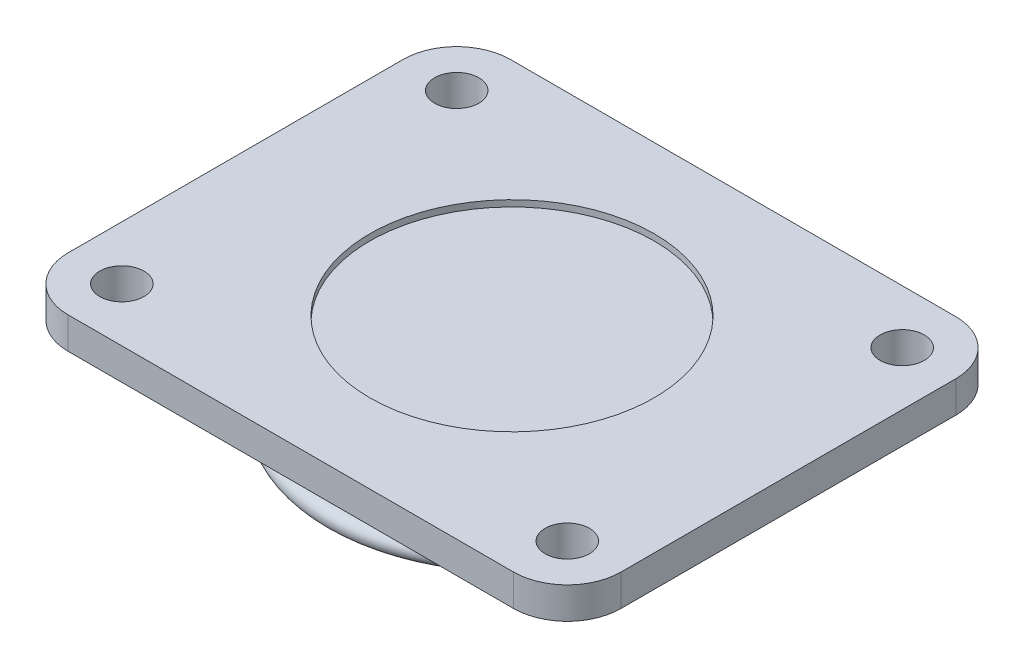
ISO-10303-21;
HEADER;
FILE_DESCRIPTION(('STEP AP214'),'2;1');
FILE_NAME('part.step','',(''),(''),'','','');
FILE_SCHEMA(('AUTOMOTIVE_DESIGN { 1 0 10303 214 1 1 1 1 }'));
ENDSEC;
DATA;
#1=APPLICATION_CONTEXT('core data for automotive mechanical design processes');
#2=APPLICATION_PROTOCOL_DEFINITION('international standard','automotive_design',2000,#1);
#3=PRODUCT_CONTEXT('',#1,'mechanical');
#4=PRODUCT('Part','Part','',(#3));
#5=PRODUCT_RELATED_PRODUCT_CATEGORY('part','',(#4));
#6=PRODUCT_DEFINITION_FORMATION('','',#4);
#7=PRODUCT_DEFINITION_CONTEXT('part definition',#1,'design');
#8=PRODUCT_DEFINITION('design','',#6,#7);
#9=PRODUCT_DEFINITION_SHAPE('','',#8);
#10=(LENGTH_UNIT() NAMED_UNIT(*) SI_UNIT(.MILLI.,.METRE.));
#11=(NAMED_UNIT(*) PLANE_ANGLE_UNIT() SI_UNIT($,.RADIAN.));
#12=(NAMED_UNIT(*) SI_UNIT($,.STERADIAN.) SOLID_ANGLE_UNIT());
#13=UNCERTAINTY_MEASURE_WITH_UNIT(LENGTH_MEASURE(1.E-05),#10,'distance_accuracy_value','');
#14=(GEOMETRIC_REPRESENTATION_CONTEXT(3) GLOBAL_UNCERTAINTY_ASSIGNED_CONTEXT((#13)) GLOBAL_UNIT_ASSIGNED_CONTEXT((#10,
#11,#12)) REPRESENTATION_CONTEXT('',''));
#15=CARTESIAN_POINT('',(0.,0.,0.));
#16=DIRECTION('',(0.,0.,1.));
#17=DIRECTION('',(1.,0.,0.));
#18=AXIS2_PLACEMENT_3D('',#15,#16,#17);
#19=CARTESIAN_POINT('',(-70.5,10.,53.));
#20=DIRECTION('',(0.,-1.,0.));
#21=DIRECTION('',(0.,0.,-1.));
#22=AXIS2_PLACEMENT_3D('',#19,#20,#21);
#23=PLANE('',#22);
#24=CARTESIAN_POINT('',(0.,10.,0.));
#25=DIRECTION('',(0.,1.,0.));
#26=DIRECTION('',(0.,0.,1.));
#27=AXIS2_PLACEMENT_3D('',#24,#25,#26);
#28=CIRCLE('',#27,45.);
#29=CARTESIAN_POINT('',(0.,10.,45.));
#30=VERTEX_POINT('',#29);
#31=EDGE_CURVE('E288',#30,#30,#28,.T.);
#32=ORIENTED_EDGE('',*,*,#31,.F.);
#33=EDGE_LOOP('',(#32));
#34=FACE_BOUND('',#33,.T.);
#35=CARTESIAN_POINT('',(-70.5,10.,53.));
#36=DIRECTION('',(0.,1.,0.));
#37=DIRECTION('',(0.,0.,-1.));
#38=AXIS2_PLACEMENT_3D('',#35,#36,#37);
#39=CIRCLE('',#38,17.);
#40=CARTESIAN_POINT('',(-87.5,10.,52.9999999999999));
#41=VERTEX_POINT('',#40);
#42=CARTESIAN_POINT('',(-70.4999999999999,10.,70.));
#43=VERTEX_POINT('',#42);
#44=EDGE_CURVE('E150',#41,#43,#39,.T.);
#45=ORIENTED_EDGE('',*,*,#44,.T.);
#46=DIRECTION('',(1.,0.,0.));
#47=VECTOR('',#46,1.);
#48=CARTESIAN_POINT('',(70.4999999999999,10.,70.));
#49=LINE('',#48,#47);
#50=CARTESIAN_POINT('',(70.4999999999999,10.,70.));
#51=VERTEX_POINT('',#50);
#52=EDGE_CURVE('E98',#43,#51,#49,.T.);
#53=ORIENTED_EDGE('',*,*,#52,.T.);
#54=CARTESIAN_POINT('',(70.5,10.,53.));
#55=DIRECTION('',(0.,1.,0.));
#56=DIRECTION('',(0.,0.,1.));
#57=AXIS2_PLACEMENT_3D('',#54,#55,#56);
#58=CIRCLE('',#57,17.);
#59=CARTESIAN_POINT('',(87.5,10.,52.9999999999999));
#60=VERTEX_POINT('',#59);
#61=EDGE_CURVE('E201',#51,#60,#58,.T.);
#62=ORIENTED_EDGE('',*,*,#61,.T.);
#63=DIRECTION('',(0.,0.,-1.));
#64=VECTOR('',#63,1.);
#65=CARTESIAN_POINT('',(87.5,10.,52.9999999999999));
#66=LINE('',#65,#64);
#67=CARTESIAN_POINT('',(87.5,10.,-52.9999999999999));
#68=VERTEX_POINT('',#67);
#69=EDGE_CURVE('E203',#60,#68,#66,.T.);
#70=ORIENTED_EDGE('',*,*,#69,.T.);
#71=CARTESIAN_POINT('',(70.5,10.,-53.));
#72=DIRECTION('',(0.,1.,0.));
#73=DIRECTION('',(0.,0.,1.));
#74=AXIS2_PLACEMENT_3D('',#71,#72,#73);
#75=CIRCLE('',#74,17.);
#76=CARTESIAN_POINT('',(70.4999999999999,10.,-70.));
#77=VERTEX_POINT('',#76);
#78=EDGE_CURVE('E117',#68,#77,#75,.T.);
#79=ORIENTED_EDGE('',*,*,#78,.T.);
#80=DIRECTION('',(-1.,0.,0.));
#81=VECTOR('',#80,1.);
#82=CARTESIAN_POINT('',(70.4999999999999,10.,-70.));
#83=LINE('',#82,#81);
#84=CARTESIAN_POINT('',(-70.4999999999999,10.,-70.));
#85=VERTEX_POINT('',#84);
#86=EDGE_CURVE('E111',#77,#85,#83,.T.);
#87=ORIENTED_EDGE('',*,*,#86,.T.);
#88=CARTESIAN_POINT('',(-70.5,10.,-53.));
#89=DIRECTION('',(0.,1.,0.));
#90=DIRECTION('',(0.,0.,1.));
#91=AXIS2_PLACEMENT_3D('',#88,#89,#90);
#92=CIRCLE('',#91,17.);
#93=CARTESIAN_POINT('',(-87.5,10.,-52.9999999999999));
#94=VERTEX_POINT('',#93);
#95=EDGE_CURVE('E115',#85,#94,#92,.T.);
#96=ORIENTED_EDGE('',*,*,#95,.T.);
#97=DIRECTION('',(0.,0.,1.));
#98=VECTOR('',#97,1.);
#99=CARTESIAN_POINT('',(-87.5,10.,52.9999999999999));
#100=LINE('',#99,#98);
#101=EDGE_CURVE('E54',#94,#41,#100,.T.);
#102=ORIENTED_EDGE('',*,*,#101,.T.);
#103=EDGE_LOOP('',(#45,#53,#62,#70,#79,#87,#96,#102));
#104=FACE_BOUND('',#103,.T.);
#105=CARTESIAN_POINT('',(-70.5,10.,-53.));
#106=DIRECTION('',(0.,1.,0.));
#107=DIRECTION('',(0.,0.,1.));
#108=AXIS2_PLACEMENT_3D('',#105,#106,#107);
#109=CIRCLE('',#108,7.);
#110=CARTESIAN_POINT('',(-70.5,10.,-46.));
#111=VERTEX_POINT('',#110);
#112=EDGE_CURVE('E139',#111,#111,#109,.T.);
#113=ORIENTED_EDGE('',*,*,#112,.F.);
#114=EDGE_LOOP('',(#113));
#115=FACE_BOUND('',#114,.T.);
#116=CARTESIAN_POINT('',(70.5,10.,-53.));
#117=DIRECTION('',(0.,1.,0.));
#118=DIRECTION('',(0.,0.,1.));
#119=AXIS2_PLACEMENT_3D('',#116,#117,#118);
#120=CIRCLE('',#119,7.);
#121=CARTESIAN_POINT('',(70.5,10.,-46.));
#122=VERTEX_POINT('',#121);
#123=EDGE_CURVE('E189',#122,#122,#120,.T.);
#124=ORIENTED_EDGE('',*,*,#123,.F.);
#125=EDGE_LOOP('',(#124));
#126=FACE_BOUND('',#125,.T.);
#127=CARTESIAN_POINT('',(70.5,10.,53.));
#128=DIRECTION('',(0.,1.,0.));
#129=DIRECTION('',(0.,0.,1.));
#130=AXIS2_PLACEMENT_3D('',#127,#128,#129);
#131=CIRCLE('',#130,7.);
#132=CARTESIAN_POINT('',(70.5,10.,60.));
#133=VERTEX_POINT('',#132);
#134=EDGE_CURVE('E183',#133,#133,#131,.T.);
#135=ORIENTED_EDGE('',*,*,#134,.F.);
#136=EDGE_LOOP('',(#135));
#137=FACE_BOUND('',#136,.T.);
#138=CARTESIAN_POINT('',(-70.5,10.,53.));
#139=DIRECTION('',(0.,1.,0.));
#140=DIRECTION('',(0.,0.,1.));
#141=AXIS2_PLACEMENT_3D('',#138,#139,#140);
#142=CIRCLE('',#141,7.);
#143=CARTESIAN_POINT('',(-70.5,10.,60.));
#144=VERTEX_POINT('',#143);
#145=EDGE_CURVE('E176',#144,#144,#142,.T.);
#146=ORIENTED_EDGE('',*,*,#145,.F.);
#147=EDGE_LOOP('',(#146));
#148=FACE_BOUND('',#147,.T.);
#149=ADVANCED_FACE('F37',(#34,#104,#115,#126,#137,#148),#23,.F.);
#150=CARTESIAN_POINT('',(-70.5,0.,53.));
#151=DIRECTION('',(0.,-1.,0.));
#152=DIRECTION('',(0.,0.,-1.));
#153=AXIS2_PLACEMENT_3D('',#150,#151,#152);
#154=PLANE('',#153);
#155=CARTESIAN_POINT('',(0.,0.,0.));
#156=DIRECTION('',(0.,-1.,0.));
#157=DIRECTION('',(0.,0.,-1.));
#158=AXIS2_PLACEMENT_3D('',#155,#156,#157);
#159=CIRCLE('',#158,56.);
#160=CARTESIAN_POINT('',(0.,0.,-56.));
#161=VERTEX_POINT('',#160);
#162=EDGE_CURVE('E164',#161,#161,#159,.T.);
#163=ORIENTED_EDGE('',*,*,#162,.F.);
#164=EDGE_LOOP('',(#163));
#165=FACE_BOUND('',#164,.T.);
#166=CARTESIAN_POINT('',(70.5,0.,53.));
#167=DIRECTION('',(0.,1.,0.));
#168=DIRECTION('',(0.,0.,1.));
#169=AXIS2_PLACEMENT_3D('',#166,#167,#168);
#170=CIRCLE('',#169,7.);
#171=CARTESIAN_POINT('',(70.5,0.,60.));
#172=VERTEX_POINT('',#171);
#173=EDGE_CURVE('E179',#172,#172,#170,.T.);
#174=ORIENTED_EDGE('',*,*,#173,.T.);
#175=EDGE_LOOP('',(#174));
#176=FACE_BOUND('',#175,.T.);
#177=CARTESIAN_POINT('',(-70.5,0.,-53.));
#178=DIRECTION('',(0.,1.,0.));
#179=DIRECTION('',(0.,0.,1.));
#180=AXIS2_PLACEMENT_3D('',#177,#178,#179);
#181=CIRCLE('',#180,7.);
#182=CARTESIAN_POINT('',(-70.5,0.,-46.));
#183=VERTEX_POINT('',#182);
#184=EDGE_CURVE('E192',#183,#183,#181,.T.);
#185=ORIENTED_EDGE('',*,*,#184,.T.);
#186=EDGE_LOOP('',(#185));
#187=FACE_BOUND('',#186,.T.);
#188=CARTESIAN_POINT('',(-70.5,0.,53.));
#189=DIRECTION('',(0.,1.,0.));
#190=DIRECTION('',(0.,0.,-1.));
#191=AXIS2_PLACEMENT_3D('',#188,#189,#190);
#192=CIRCLE('',#191,17.);
#193=CARTESIAN_POINT('',(-87.5,0.,52.9999999999999));
#194=VERTEX_POINT('',#193);
#195=CARTESIAN_POINT('',(-70.4999999999999,0.,70.));
#196=VERTEX_POINT('',#195);
#197=EDGE_CURVE('E135',#194,#196,#192,.T.);
#198=ORIENTED_EDGE('',*,*,#197,.F.);
#199=DIRECTION('',(0.,0.,1.));
#200=VECTOR('',#199,1.);
#201=CARTESIAN_POINT('',(-87.5,0.,52.9999999999999));
#202=LINE('',#201,#200);
#203=CARTESIAN_POINT('',(-87.5,0.,-52.9999999999999));
#204=VERTEX_POINT('',#203);
#205=EDGE_CURVE('E89',#204,#194,#202,.T.);
#206=ORIENTED_EDGE('',*,*,#205,.F.);
#207=CARTESIAN_POINT('',(-70.5,0.,-53.));
#208=DIRECTION('',(0.,1.,0.));
#209=DIRECTION('',(0.,0.,1.));
#210=AXIS2_PLACEMENT_3D('',#207,#208,#209);
#211=CIRCLE('',#210,17.);
#212=CARTESIAN_POINT('',(-70.4999999999999,0.,-70.));
#213=VERTEX_POINT('',#212);
#214=EDGE_CURVE('E83',#213,#204,#211,.T.);
#215=ORIENTED_EDGE('',*,*,#214,.F.);
#216=DIRECTION('',(-1.,0.,0.));
#217=VECTOR('',#216,1.);
#218=CARTESIAN_POINT('',(70.4999999999999,0.,-70.));
#219=LINE('',#218,#217);
#220=CARTESIAN_POINT('',(70.4999999999999,0.,-70.));
#221=VERTEX_POINT('',#220);
#222=EDGE_CURVE('E125',#221,#213,#219,.T.);
#223=ORIENTED_EDGE('',*,*,#222,.F.);
#224=CARTESIAN_POINT('',(70.5,0.,-53.));
#225=DIRECTION('',(0.,1.,0.));
#226=DIRECTION('',(0.,0.,1.));
#227=AXIS2_PLACEMENT_3D('',#224,#225,#226);
#228=CIRCLE('',#227,17.);
#229=CARTESIAN_POINT('',(87.5,0.,-52.9999999999999));
#230=VERTEX_POINT('',#229);
#231=EDGE_CURVE('E145',#230,#221,#228,.T.);
#232=ORIENTED_EDGE('',*,*,#231,.F.);
#233=DIRECTION('',(0.,0.,-1.));
#234=VECTOR('',#233,1.);
#235=CARTESIAN_POINT('',(87.5,0.,52.9999999999999));
#236=LINE('',#235,#234);
#237=CARTESIAN_POINT('',(87.5,0.,52.9999999999999));
#238=VERTEX_POINT('',#237);
#239=EDGE_CURVE('E143',#238,#230,#236,.T.);
#240=ORIENTED_EDGE('',*,*,#239,.F.);
#241=CARTESIAN_POINT('',(70.5,0.,53.));
#242=DIRECTION('',(0.,1.,0.));
#243=DIRECTION('',(0.,0.,1.));
#244=AXIS2_PLACEMENT_3D('',#241,#242,#243);
#245=CIRCLE('',#244,17.);
#246=CARTESIAN_POINT('',(70.4999999999999,0.,70.));
#247=VERTEX_POINT('',#246);
#248=EDGE_CURVE('E141',#247,#238,#245,.T.);
#249=ORIENTED_EDGE('',*,*,#248,.F.);
#250=DIRECTION('',(1.,0.,0.));
#251=VECTOR('',#250,1.);
#252=CARTESIAN_POINT('',(70.4999999999999,0.,70.));
#253=LINE('',#252,#251);
#254=EDGE_CURVE('E138',#196,#247,#253,.T.);
#255=ORIENTED_EDGE('',*,*,#254,.F.);
#256=EDGE_LOOP('',(#198,#206,#215,#223,#232,#240,#249,#255));
#257=FACE_BOUND('',#256,.T.);
#258=CARTESIAN_POINT('',(70.5,0.,-53.));
#259=DIRECTION('',(0.,1.,0.));
#260=DIRECTION('',(0.,0.,1.));
#261=AXIS2_PLACEMENT_3D('',#258,#259,#260);
#262=CIRCLE('',#261,7.);
#263=CARTESIAN_POINT('',(70.5,0.,-46.));
#264=VERTEX_POINT('',#263);
#265=EDGE_CURVE('E186',#264,#264,#262,.T.);
#266=ORIENTED_EDGE('',*,*,#265,.T.);
#267=EDGE_LOOP('',(#266));
#268=FACE_BOUND('',#267,.T.);
#269=CARTESIAN_POINT('',(-70.5,0.,53.));
#270=DIRECTION('',(0.,1.,0.));
#271=DIRECTION('',(0.,0.,1.));
#272=AXIS2_PLACEMENT_3D('',#269,#270,#271);
#273=CIRCLE('',#272,7.);
#274=CARTESIAN_POINT('',(-70.5,0.,60.));
#275=VERTEX_POINT('',#274);
#276=EDGE_CURVE('E180',#275,#275,#273,.T.);
#277=ORIENTED_EDGE('',*,*,#276,.T.);
#278=EDGE_LOOP('',(#277));
#279=FACE_BOUND('',#278,.T.);
#280=ADVANCED_FACE('F216',(#165,#176,#187,#257,#268,#279),#154,.T.);
#281=CARTESIAN_POINT('',(-70.5,10.,53.));
#282=DIRECTION('',(0.,-1.,0.));
#283=DIRECTION('',(0.,0.,-1.));
#284=AXIS2_PLACEMENT_3D('',#281,#282,#283);
#285=CYLINDRICAL_SURFACE('',#284,17.);
#286=ORIENTED_EDGE('',*,*,#197,.T.);
#287=DIRECTION('',(0.,-1.,0.));
#288=VECTOR('',#287,1.);
#289=CARTESIAN_POINT('',(-70.4999999999999,10.,70.));
#290=LINE('',#289,#288);
#291=EDGE_CURVE('E163',#43,#196,#290,.T.);
#292=ORIENTED_EDGE('',*,*,#291,.F.);
#293=ORIENTED_EDGE('',*,*,#44,.F.);
#294=DIRECTION('',(0.,-1.,0.));
#295=VECTOR('',#294,1.);
#296=CARTESIAN_POINT('',(-87.5,10.,52.9999999999999));
#297=LINE('',#296,#295);
#298=EDGE_CURVE('E131',#41,#194,#297,.T.);
#299=ORIENTED_EDGE('',*,*,#298,.T.);
#300=EDGE_LOOP('',(#286,#292,#293,#299));
#301=FACE_BOUND('',#300,.T.);
#302=ADVANCED_FACE('F221',(#301),#285,.T.);
#303=CARTESIAN_POINT('',(70.4999999999999,10.,70.));
#304=DIRECTION('',(0.,0.,-1.));
#305=DIRECTION('',(-1.,0.,0.));
#306=AXIS2_PLACEMENT_3D('',#303,#304,#305);
#307=PLANE('',#306);
#308=ORIENTED_EDGE('',*,*,#254,.T.);
#309=DIRECTION('',(0.,-1.,0.));
#310=VECTOR('',#309,1.);
#311=CARTESIAN_POINT('',(70.4999999999999,10.,70.));
#312=LINE('',#311,#310);
#313=EDGE_CURVE('E160',#51,#247,#312,.T.);
#314=ORIENTED_EDGE('',*,*,#313,.F.);
#315=ORIENTED_EDGE('',*,*,#52,.F.);
#316=ORIENTED_EDGE('',*,*,#291,.T.);
#317=EDGE_LOOP('',(#308,#314,#315,#316));
#318=FACE_BOUND('',#317,.T.);
#319=ADVANCED_FACE('F396',(#318),#307,.F.);
#320=CARTESIAN_POINT('',(70.5,10.,53.));
#321=DIRECTION('',(0.,-1.,0.));
#322=DIRECTION('',(0.,0.,-1.));
#323=AXIS2_PLACEMENT_3D('',#320,#321,#322);
#324=CYLINDRICAL_SURFACE('',#323,17.);
#325=ORIENTED_EDGE('',*,*,#248,.T.);
#326=DIRECTION('',(0.,-1.,0.));
#327=VECTOR('',#326,1.);
#328=CARTESIAN_POINT('',(87.5,10.,52.9999999999999));
#329=LINE('',#328,#327);
#330=EDGE_CURVE('E157',#60,#238,#329,.T.);
#331=ORIENTED_EDGE('',*,*,#330,.F.);
#332=ORIENTED_EDGE('',*,*,#61,.F.);
#333=ORIENTED_EDGE('',*,*,#313,.T.);
#334=EDGE_LOOP('',(#325,#331,#332,#333));
#335=FACE_BOUND('',#334,.T.);
#336=ADVANCED_FACE('F387',(#335),#324,.T.);
#337=CARTESIAN_POINT('',(87.5,10.,52.9999999999999));
#338=DIRECTION('',(-1.,0.,0.));
#339=DIRECTION('',(0.,0.,1.));
#340=AXIS2_PLACEMENT_3D('',#337,#338,#339);
#341=PLANE('',#340);
#342=ORIENTED_EDGE('',*,*,#239,.T.);
#343=DIRECTION('',(0.,-1.,0.));
#344=VECTOR('',#343,1.);
#345=CARTESIAN_POINT('',(87.5,10.,-52.9999999999999));
#346=LINE('',#345,#344);
#347=EDGE_CURVE('E154',#68,#230,#346,.T.);
#348=ORIENTED_EDGE('',*,*,#347,.F.);
#349=ORIENTED_EDGE('',*,*,#69,.F.);
#350=ORIENTED_EDGE('',*,*,#330,.T.);
#351=EDGE_LOOP('',(#342,#348,#349,#350));
#352=FACE_BOUND('',#351,.T.);
#353=ADVANCED_FACE('F209',(#352),#341,.F.);
#354=CARTESIAN_POINT('',(70.5,10.,-53.));
#355=DIRECTION('',(0.,-1.,0.));
#356=DIRECTION('',(0.,0.,-1.));
#357=AXIS2_PLACEMENT_3D('',#354,#355,#356);
#358=CYLINDRICAL_SURFACE('',#357,17.);
#359=ORIENTED_EDGE('',*,*,#231,.T.);
#360=DIRECTION('',(0.,-1.,0.));
#361=VECTOR('',#360,1.);
#362=CARTESIAN_POINT('',(70.4999999999999,10.,-70.));
#363=LINE('',#362,#361);
#364=EDGE_CURVE('E126',#77,#221,#363,.T.);
#365=ORIENTED_EDGE('',*,*,#364,.F.);
#366=ORIENTED_EDGE('',*,*,#78,.F.);
#367=ORIENTED_EDGE('',*,*,#347,.T.);
#368=EDGE_LOOP('',(#359,#365,#366,#367));
#369=FACE_BOUND('',#368,.T.);
#370=ADVANCED_FACE('F213',(#369),#358,.T.);
#371=CARTESIAN_POINT('',(70.4999999999999,10.,-70.));
#372=DIRECTION('',(0.,0.,1.));
#373=DIRECTION('',(1.,0.,0.));
#374=AXIS2_PLACEMENT_3D('',#371,#372,#373);
#375=PLANE('',#374);
#376=ORIENTED_EDGE('',*,*,#222,.T.);
#377=DIRECTION('',(0.,-1.,0.));
#378=VECTOR('',#377,1.);
#379=CARTESIAN_POINT('',(-70.4999999999999,10.,-70.));
#380=LINE('',#379,#378);
#381=EDGE_CURVE('E122',#85,#213,#380,.T.);
#382=ORIENTED_EDGE('',*,*,#381,.F.);
#383=ORIENTED_EDGE('',*,*,#86,.F.);
#384=ORIENTED_EDGE('',*,*,#364,.T.);
#385=EDGE_LOOP('',(#376,#382,#383,#384));
#386=FACE_BOUND('',#385,.T.);
#387=ADVANCED_FACE('F123',(#386),#375,.F.);
#388=CARTESIAN_POINT('',(-70.5,10.,-53.));
#389=DIRECTION('',(0.,-1.,0.));
#390=DIRECTION('',(0.,0.,-1.));
#391=AXIS2_PLACEMENT_3D('',#388,#389,#390);
#392=CYLINDRICAL_SURFACE('',#391,17.);
#393=ORIENTED_EDGE('',*,*,#214,.T.);
#394=DIRECTION('',(0.,-1.,0.));
#395=VECTOR('',#394,1.);
#396=CARTESIAN_POINT('',(-87.5,10.,-52.9999999999999));
#397=LINE('',#396,#395);
#398=EDGE_CURVE('E127',#94,#204,#397,.T.);
#399=ORIENTED_EDGE('',*,*,#398,.F.);
#400=ORIENTED_EDGE('',*,*,#95,.F.);
#401=ORIENTED_EDGE('',*,*,#381,.T.);
#402=EDGE_LOOP('',(#393,#399,#400,#401));
#403=FACE_BOUND('',#402,.T.);
#404=ADVANCED_FACE('F129',(#403),#392,.T.);
#405=CARTESIAN_POINT('',(-87.5,10.,52.9999999999999));
#406=DIRECTION('',(1.,0.,0.));
#407=DIRECTION('',(0.,0.,-1.));
#408=AXIS2_PLACEMENT_3D('',#405,#406,#407);
#409=PLANE('',#408);
#410=ORIENTED_EDGE('',*,*,#205,.T.);
#411=ORIENTED_EDGE('',*,*,#298,.F.);
#412=ORIENTED_EDGE('',*,*,#101,.F.);
#413=ORIENTED_EDGE('',*,*,#398,.T.);
#414=EDGE_LOOP('',(#410,#411,#412,#413));
#415=FACE_BOUND('',#414,.T.);
#416=ADVANCED_FACE('F223',(#415),#409,.F.);
#417=CARTESIAN_POINT('',(-70.5,10.,-53.));
#418=DIRECTION('',(0.,-1.,0.));
#419=DIRECTION('',(0.,0.,-1.));
#420=AXIS2_PLACEMENT_3D('',#417,#418,#419);
#421=CYLINDRICAL_SURFACE('',#420,7.);
#422=ORIENTED_EDGE('',*,*,#112,.T.);
#423=EDGE_LOOP('',(#422));
#424=FACE_BOUND('',#423,.T.);
#425=ORIENTED_EDGE('',*,*,#184,.F.);
#426=EDGE_LOOP('',(#425));
#427=FACE_BOUND('',#426,.T.);
#428=ADVANCED_FACE('F225',(#424,#427),#421,.F.);
#429=CARTESIAN_POINT('',(70.5,10.,-53.));
#430=DIRECTION('',(0.,-1.,0.));
#431=DIRECTION('',(0.,0.,-1.));
#432=AXIS2_PLACEMENT_3D('',#429,#430,#431);
#433=CYLINDRICAL_SURFACE('',#432,7.);
#434=ORIENTED_EDGE('',*,*,#123,.T.);
#435=EDGE_LOOP('',(#434));
#436=FACE_BOUND('',#435,.T.);
#437=ORIENTED_EDGE('',*,*,#265,.F.);
#438=EDGE_LOOP('',(#437));
#439=FACE_BOUND('',#438,.T.);
#440=ADVANCED_FACE('F231',(#436,#439),#433,.F.);
#441=CARTESIAN_POINT('',(70.5,10.,53.));
#442=DIRECTION('',(0.,-1.,0.));
#443=DIRECTION('',(0.,0.,-1.));
#444=AXIS2_PLACEMENT_3D('',#441,#442,#443);
#445=CYLINDRICAL_SURFACE('',#444,7.);
#446=ORIENTED_EDGE('',*,*,#134,.T.);
#447=EDGE_LOOP('',(#446));
#448=FACE_BOUND('',#447,.T.);
#449=ORIENTED_EDGE('',*,*,#173,.F.);
#450=EDGE_LOOP('',(#449));
#451=FACE_BOUND('',#450,.T.);
#452=ADVANCED_FACE('F247',(#448,#451),#445,.F.);
#453=CARTESIAN_POINT('',(-70.5,10.,53.));
#454=DIRECTION('',(0.,-1.,0.));
#455=DIRECTION('',(0.,0.,-1.));
#456=AXIS2_PLACEMENT_3D('',#453,#454,#455);
#457=CYLINDRICAL_SURFACE('',#456,7.);
#458=ORIENTED_EDGE('',*,*,#145,.T.);
#459=EDGE_LOOP('',(#458));
#460=FACE_BOUND('',#459,.T.);
#461=ORIENTED_EDGE('',*,*,#276,.F.);
#462=EDGE_LOOP('',(#461));
#463=FACE_BOUND('',#462,.T.);
#464=ADVANCED_FACE('F251',(#460,#463),#457,.F.);
#465=CARTESIAN_POINT('',(0.,-20.,0.));
#466=DIRECTION('',(0.,1.,0.));
#467=DIRECTION('',(0.,0.,1.));
#468=AXIS2_PLACEMENT_3D('',#465,#466,#467);
#469=CYLINDRICAL_SURFACE('',#468,56.);
#470=CARTESIAN_POINT('',(0.,-14.,0.));
#471=DIRECTION('',(0.,-1.,0.));
#472=DIRECTION('',(0.,0.,-1.));
#473=AXIS2_PLACEMENT_3D('',#470,#471,#472);
#474=CIRCLE('',#473,56.);
#475=CARTESIAN_POINT('',(0.,-14.,-56.));
#476=VERTEX_POINT('',#475);
#477=EDGE_CURVE('E174',#476,#476,#474,.F.);
#478=ORIENTED_EDGE('',*,*,#477,.T.);
#479=EDGE_LOOP('',(#478));
#480=FACE_BOUND('',#479,.T.);
#481=ORIENTED_EDGE('',*,*,#162,.T.);
#482=EDGE_LOOP('',(#481));
#483=FACE_BOUND('',#482,.T.);
#484=ADVANCED_FACE('F255',(#480,#483),#469,.T.);
#485=CARTESIAN_POINT('',(0.,-17.,0.));
#486=DIRECTION('',(0.,1.,0.));
#487=DIRECTION('',(0.,0.,1.));
#488=AXIS2_PLACEMENT_3D('',#485,#486,#487);
#489=TOROIDAL_SURFACE('',#488,56.,3.);
#490=CARTESIAN_POINT('',(0.,-20.,0.));
#491=DIRECTION('',(0.,1.,0.));
#492=DIRECTION('',(0.,0.,1.));
#493=AXIS2_PLACEMENT_3D('',#490,#491,#492);
#494=CIRCLE('',#493,56.);
#495=CARTESIAN_POINT('',(0.,-20.,56.));
#496=VERTEX_POINT('',#495);
#497=EDGE_CURVE('E291',#496,#496,#494,.T.);
#498=ORIENTED_EDGE('',*,*,#497,.T.);
#499=EDGE_LOOP('',(#498));
#500=FACE_BOUND('',#499,.T.);
#501=ORIENTED_EDGE('',*,*,#477,.F.);
#502=EDGE_LOOP('',(#501));
#503=FACE_BOUND('',#502,.T.);
#504=ADVANCED_FACE('F259',(#500,#503),#489,.T.);
#505=CARTESIAN_POINT('',(0.,-20.,0.));
#506=DIRECTION('',(0.,-1.,0.));
#507=DIRECTION('',(0.,0.,-1.));
#508=AXIS2_PLACEMENT_3D('',#505,#506,#507);
#509=PLANE('',#508);
#510=CARTESIAN_POINT('',(0.,-20.,0.));
#511=DIRECTION('',(0.,-1.,0.));
#512=DIRECTION('',(0.,0.,-1.));
#513=AXIS2_PLACEMENT_3D('',#510,#511,#512);
#514=CIRCLE('',#513,7.5);
#515=CARTESIAN_POINT('',(0.,-20.,-7.5));
#516=VERTEX_POINT('',#515);
#517=EDGE_CURVE('E287',#516,#516,#514,.T.);
#518=ORIENTED_EDGE('',*,*,#517,.F.);
#519=EDGE_LOOP('',(#518));
#520=FACE_BOUND('',#519,.T.);
#521=ORIENTED_EDGE('',*,*,#497,.F.);
#522=EDGE_LOOP('',(#521));
#523=FACE_BOUND('',#522,.T.);
#524=ADVANCED_FACE('F261',(#520,#523),#509,.T.);
#525=CARTESIAN_POINT('',(0.,-45.,0.));
#526=DIRECTION('',(0.,1.,0.));
#527=DIRECTION('',(0.,0.,1.));
#528=AXIS2_PLACEMENT_3D('',#525,#526,#527);
#529=CYLINDRICAL_SURFACE('',#528,7.5);
#530=CARTESIAN_POINT('',(0.,-44.,0.));
#531=DIRECTION('',(0.,-1.,0.));
#532=DIRECTION('',(0.,0.,-1.));
#533=AXIS2_PLACEMENT_3D('',#530,#531,#532);
#534=CIRCLE('',#533,7.5);
#535=CARTESIAN_POINT('',(0.,-44.,-7.5));
#536=VERTEX_POINT('',#535);
#537=EDGE_CURVE('E11',#536,#536,#534,.F.);
#538=ORIENTED_EDGE('',*,*,#537,.T.);
#539=EDGE_LOOP('',(#538));
#540=FACE_BOUND('',#539,.T.);
#541=ORIENTED_EDGE('',*,*,#517,.T.);
#542=EDGE_LOOP('',(#541));
#543=FACE_BOUND('',#542,.T.);
#544=ADVANCED_FACE('F264',(#540,#543),#529,.T.);
#545=CARTESIAN_POINT('',(0.,-45.,0.));
#546=DIRECTION('',(0.,-1.,0.));
#547=DIRECTION('',(0.,0.,-1.));
#548=AXIS2_PLACEMENT_3D('',#545,#546,#547);
#549=PLANE('',#548);
#550=CARTESIAN_POINT('',(0.,-45.,0.));
#551=DIRECTION('',(0.,-1.,0.));
#552=DIRECTION('',(0.,0.,-1.));
#553=AXIS2_PLACEMENT_3D('',#550,#551,#552);
#554=CIRCLE('',#553,6.50000000000001);
#555=CARTESIAN_POINT('',(0.,-45.,-6.50000000000001));
#556=VERTEX_POINT('',#555);
#557=EDGE_CURVE('E46',#556,#556,#554,.T.);
#558=ORIENTED_EDGE('',*,*,#557,.T.);
#559=EDGE_LOOP('',(#558));
#560=FACE_BOUND('',#559,.T.);
#561=ADVANCED_FACE('F271',(#560),#549,.T.);
#562=CARTESIAN_POINT('',(0.,-45.,0.));
#563=DIRECTION('',(0.,1.,0.));
#564=DIRECTION('',(0.,0.,1.));
#565=AXIS2_PLACEMENT_3D('',#562,#563,#564);
#566=CONICAL_SURFACE('',#565,6.50000000000001,0.785398163397435);
#567=ORIENTED_EDGE('',*,*,#537,.F.);
#568=EDGE_LOOP('',(#567));
#569=FACE_BOUND('',#568,.T.);
#570=ORIENTED_EDGE('',*,*,#557,.F.);
#571=EDGE_LOOP('',(#570));
#572=FACE_BOUND('',#571,.T.);
#573=ADVANCED_FACE('F39',(#569,#572),#566,.T.);
#574=CARTESIAN_POINT('',(0.,8.,0.));
#575=DIRECTION('',(0.,1.,0.));
#576=DIRECTION('',(0.,0.,1.));
#577=AXIS2_PLACEMENT_3D('',#574,#575,#576);
#578=CYLINDRICAL_SURFACE('',#577,45.);
#579=CARTESIAN_POINT('',(0.,8.,0.));
#580=DIRECTION('',(0.,1.,0.));
#581=DIRECTION('',(0.,0.,1.));
#582=AXIS2_PLACEMENT_3D('',#579,#580,#581);
#583=CIRCLE('',#582,45.);
#584=CARTESIAN_POINT('',(0.,8.,45.));
#585=VERTEX_POINT('',#584);
#586=EDGE_CURVE('E286',#585,#585,#583,.T.);
#587=ORIENTED_EDGE('',*,*,#586,.F.);
#588=EDGE_LOOP('',(#587));
#589=FACE_BOUND('',#588,.T.);
#590=ORIENTED_EDGE('',*,*,#31,.T.);
#591=EDGE_LOOP('',(#590));
#592=FACE_BOUND('',#591,.T.);
#593=ADVANCED_FACE('F275',(#589,#592),#578,.F.);
#594=CARTESIAN_POINT('',(0.,8.,0.));
#595=DIRECTION('',(0.,1.,0.));
#596=DIRECTION('',(0.,0.,1.));
#597=AXIS2_PLACEMENT_3D('',#594,#595,#596);
#598=PLANE('',#597);
#599=ORIENTED_EDGE('',*,*,#586,.T.);
#600=EDGE_LOOP('',(#599));
#601=FACE_BOUND('',#600,.T.);
#602=ADVANCED_FACE('F278',(#601),#598,.T.);
#603=CLOSED_SHELL('',(#149,#280,#302,#319,#336,#353,#370,#387,#404,#416,#428,#440,#452,#464,
#484,#504,#524,#544,#561,#573,#593,#602));
#604=MANIFOLD_SOLID_BREP('B2',#603);
#605=ADVANCED_BREP_SHAPE_REPRESENTATION('',(#18,#604),#14);
#606=SHAPE_DEFINITION_REPRESENTATION(#9,#605);
ENDSEC;
END-ISO-10303-21;
